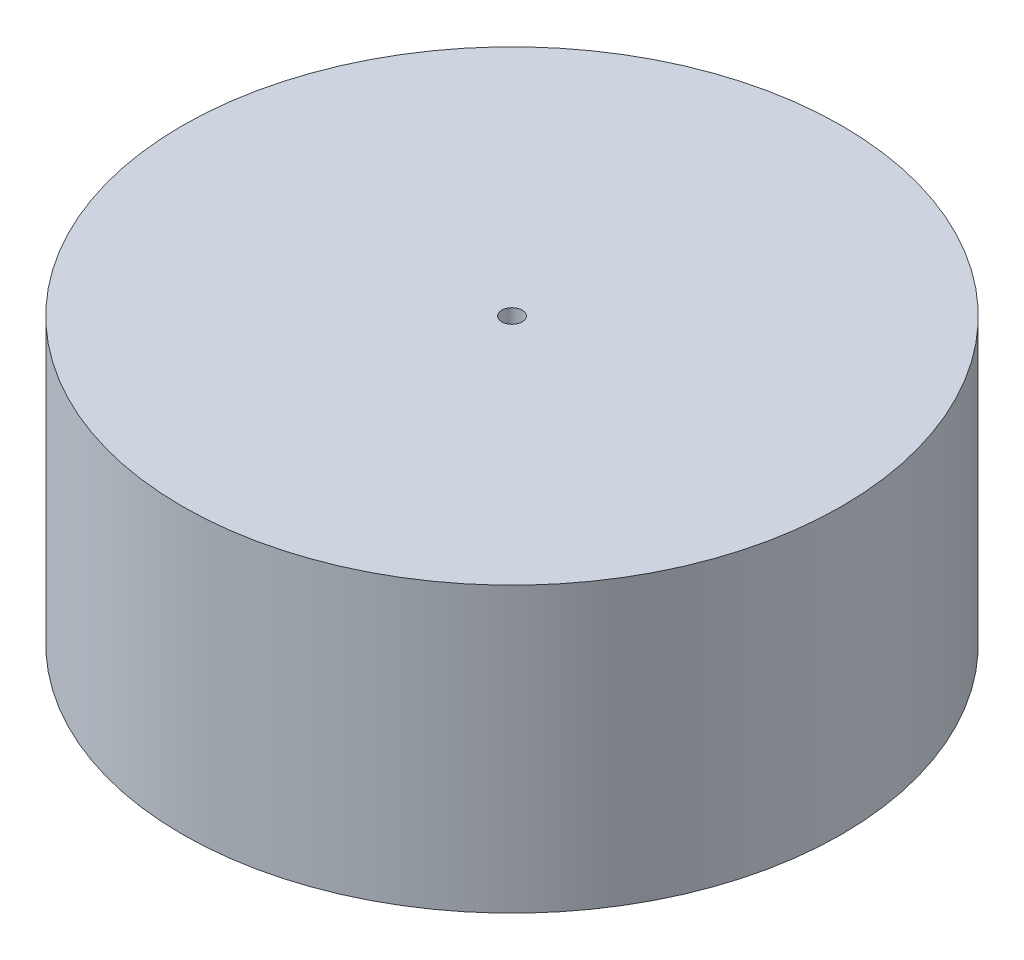
ISO-10303-21;
HEADER;
FILE_DESCRIPTION(('STEP AP214'),'2;1');
FILE_NAME('part.step','',(''),(''),'','','');
FILE_SCHEMA(('AUTOMOTIVE_DESIGN { 1 0 10303 214 1 1 1 1 }'));
ENDSEC;
DATA;
#1=APPLICATION_CONTEXT('core data for automotive mechanical design processes');
#2=APPLICATION_PROTOCOL_DEFINITION('international standard','automotive_design',2000,#1);
#3=PRODUCT_CONTEXT('',#1,'mechanical');
#4=PRODUCT('Part','Part','',(#3));
#5=PRODUCT_RELATED_PRODUCT_CATEGORY('part','',(#4));
#6=PRODUCT_DEFINITION_FORMATION('','',#4);
#7=PRODUCT_DEFINITION_CONTEXT('part definition',#1,'design');
#8=PRODUCT_DEFINITION('design','',#6,#7);
#9=PRODUCT_DEFINITION_SHAPE('','',#8);
#10=(LENGTH_UNIT() NAMED_UNIT(*) SI_UNIT(.MILLI.,.METRE.));
#11=(NAMED_UNIT(*) PLANE_ANGLE_UNIT() SI_UNIT($,.RADIAN.));
#12=(NAMED_UNIT(*) SI_UNIT($,.STERADIAN.) SOLID_ANGLE_UNIT());
#13=UNCERTAINTY_MEASURE_WITH_UNIT(LENGTH_MEASURE(1.E-05),#10,'distance_accuracy_value','');
#14=(GEOMETRIC_REPRESENTATION_CONTEXT(3) GLOBAL_UNCERTAINTY_ASSIGNED_CONTEXT((#13)) GLOBAL_UNIT_ASSIGNED_CONTEXT((#10,
#11,#12)) REPRESENTATION_CONTEXT('',''));
#15=CARTESIAN_POINT('',(0.,0.,0.));
#16=DIRECTION('',(0.,0.,1.));
#17=DIRECTION('',(1.,0.,0.));
#18=AXIS2_PLACEMENT_3D('',#15,#16,#17);
#19=CARTESIAN_POINT('',(0.,-25.,0.));
#20=DIRECTION('',(0.,1.,0.));
#21=DIRECTION('',(0.,0.,1.));
#22=AXIS2_PLACEMENT_3D('',#19,#20,#21);
#23=CYLINDRICAL_SURFACE('',#22,30.5);
#24=CARTESIAN_POINT('',(0.,0.,0.));
#25=DIRECTION('',(0.,-1.,0.));
#26=DIRECTION('',(0.,0.,-1.));
#27=AXIS2_PLACEMENT_3D('',#24,#25,#26);
#28=CIRCLE('',#27,30.5);
#29=CARTESIAN_POINT('',(0.,0.,-30.5));
#30=VERTEX_POINT('',#29);
#31=EDGE_CURVE('E123',#30,#30,#28,.T.);
#32=ORIENTED_EDGE('',*,*,#31,.F.);
#33=EDGE_LOOP('',(#32));
#34=FACE_BOUND('',#33,.T.);
#35=CARTESIAN_POINT('',(0.,-23.,0.));
#36=DIRECTION('',(0.,-1.,0.));
#37=DIRECTION('',(0.,0.,-1.));
#38=AXIS2_PLACEMENT_3D('',#35,#36,#37);
#39=CIRCLE('',#38,30.5);
#40=CARTESIAN_POINT('',(5.29626941884138,-23.,30.0366364668723));
#41=VERTEX_POINT('',#40);
#42=CARTESIAN_POINT('',(-5.29626941884138,-23.,30.0366364668723));
#43=VERTEX_POINT('',#42);
#44=EDGE_CURVE('E57',#41,#43,#39,.F.);
#45=ORIENTED_EDGE('',*,*,#44,.F.);
#46=DIRECTION('',(0.,-1.,0.));
#47=VECTOR('',#46,1.);
#48=CARTESIAN_POINT('',(5.29626941884138,-23.,30.0366364668723));
#49=LINE('',#48,#47);
#50=CARTESIAN_POINT('',(5.29626941884138,-25.,30.0366364668723));
#51=VERTEX_POINT('',#50);
#52=EDGE_CURVE('E124',#41,#51,#49,.T.);
#53=ORIENTED_EDGE('',*,*,#52,.T.);
#54=CARTESIAN_POINT('',(0.,-25.,0.));
#55=DIRECTION('',(0.,-1.,0.));
#56=DIRECTION('',(0.,0.,-1.));
#57=AXIS2_PLACEMENT_3D('',#54,#55,#56);
#58=CIRCLE('',#57,30.5);
#59=CARTESIAN_POINT('',(-5.29626941884138,-25.,30.0366364668723));
#60=VERTEX_POINT('',#59);
#61=EDGE_CURVE('E129',#51,#60,#58,.T.);
#62=ORIENTED_EDGE('',*,*,#61,.T.);
#63=DIRECTION('',(0.,-1.,0.));
#64=VECTOR('',#63,1.);
#65=CARTESIAN_POINT('',(-5.29626941884138,-23.,30.0366364668723));
#66=LINE('',#65,#64);
#67=EDGE_CURVE('E62',#43,#60,#66,.T.);
#68=ORIENTED_EDGE('',*,*,#67,.F.);
#69=EDGE_LOOP('',(#45,#53,#62,#68));
#70=FACE_BOUND('',#69,.T.);
#71=ADVANCED_FACE('F41',(#34,#70),#23,.F.);
#72=CARTESIAN_POINT('',(0.,0.,0.));
#73=DIRECTION('',(0.,1.,0.));
#74=DIRECTION('',(0.,0.,1.));
#75=AXIS2_PLACEMENT_3D('',#72,#73,#74);
#76=PLANE('',#75);
#77=CARTESIAN_POINT('',(0.,0.,0.));
#78=DIRECTION('',(0.,1.,0.));
#79=DIRECTION('',(0.,0.,1.));
#80=AXIS2_PLACEMENT_3D('',#77,#78,#79);
#81=CIRCLE('',#80,1.);
#82=CARTESIAN_POINT('',(0.,0.,1.));
#83=VERTEX_POINT('',#82);
#84=EDGE_CURVE('E139',#83,#83,#81,.T.);
#85=ORIENTED_EDGE('',*,*,#84,.T.);
#86=EDGE_LOOP('',(#85));
#87=FACE_BOUND('',#86,.T.);
#88=ORIENTED_EDGE('',*,*,#31,.T.);
#89=EDGE_LOOP('',(#88));
#90=FACE_BOUND('',#89,.T.);
#91=ADVANCED_FACE('F146',(#87,#90),#76,.F.);
#92=CARTESIAN_POINT('',(0.,3.,0.));
#93=DIRECTION('',(0.,1.,0.));
#94=DIRECTION('',(0.,0.,1.));
#95=AXIS2_PLACEMENT_3D('',#92,#93,#94);
#96=PLANE('',#95);
#97=CARTESIAN_POINT('',(0.,3.,0.));
#98=DIRECTION('',(0.,1.,0.));
#99=DIRECTION('',(0.,0.,1.));
#100=AXIS2_PLACEMENT_3D('',#97,#98,#99);
#101=CIRCLE('',#100,32.5);
#102=CARTESIAN_POINT('',(0.,3.,32.5));
#103=VERTEX_POINT('',#102);
#104=EDGE_CURVE('E11',#103,#103,#101,.T.);
#105=ORIENTED_EDGE('',*,*,#104,.T.);
#106=EDGE_LOOP('',(#105));
#107=FACE_BOUND('',#106,.T.);
#108=CARTESIAN_POINT('',(0.,3.,0.));
#109=DIRECTION('',(0.,1.,0.));
#110=DIRECTION('',(0.,0.,1.));
#111=AXIS2_PLACEMENT_3D('',#108,#109,#110);
#112=CIRCLE('',#111,1.);
#113=CARTESIAN_POINT('',(0.,3.,1.));
#114=VERTEX_POINT('',#113);
#115=EDGE_CURVE('E50',#114,#114,#112,.T.);
#116=ORIENTED_EDGE('',*,*,#115,.F.);
#117=EDGE_LOOP('',(#116));
#118=FACE_BOUND('',#117,.T.);
#119=ADVANCED_FACE('F160',(#107,#118),#96,.T.);
#120=CARTESIAN_POINT('',(0.,3.,0.));
#121=DIRECTION('',(0.,-1.,0.));
#122=DIRECTION('',(0.,0.,-1.));
#123=AXIS2_PLACEMENT_3D('',#120,#121,#122);
#124=CYLINDRICAL_SURFACE('',#123,32.5);
#125=ORIENTED_EDGE('',*,*,#104,.F.);
#126=EDGE_LOOP('',(#125));
#127=FACE_BOUND('',#126,.T.);
#128=CARTESIAN_POINT('',(0.,-25.,0.));
#129=DIRECTION('',(0.,-1.,0.));
#130=DIRECTION('',(0.,0.,-1.));
#131=AXIS2_PLACEMENT_3D('',#128,#129,#130);
#132=CIRCLE('',#131,32.5);
#133=CARTESIAN_POINT('',(0.,-25.,-32.5));
#134=VERTEX_POINT('',#133);
#135=EDGE_CURVE('E132',#134,#134,#132,.T.);
#136=ORIENTED_EDGE('',*,*,#135,.F.);
#137=EDGE_LOOP('',(#136));
#138=FACE_BOUND('',#137,.T.);
#139=ADVANCED_FACE('F43',(#127,#138),#124,.T.);
#140=CARTESIAN_POINT('',(0.,3.,0.));
#141=DIRECTION('',(0.,-1.,0.));
#142=DIRECTION('',(0.,0.,-1.));
#143=AXIS2_PLACEMENT_3D('',#140,#141,#142);
#144=CYLINDRICAL_SURFACE('',#143,1.);
#145=ORIENTED_EDGE('',*,*,#115,.T.);
#146=EDGE_LOOP('',(#145));
#147=FACE_BOUND('',#146,.T.);
#148=ORIENTED_EDGE('',*,*,#84,.F.);
#149=EDGE_LOOP('',(#148));
#150=FACE_BOUND('',#149,.T.);
#151=ADVANCED_FACE('F149',(#147,#150),#144,.F.);
#152=CARTESIAN_POINT('',(0.,-25.,0.));
#153=DIRECTION('',(0.,-1.,0.));
#154=DIRECTION('',(0.,0.,-1.));
#155=AXIS2_PLACEMENT_3D('',#152,#153,#154);
#156=PLANE('',#155);
#157=ORIENTED_EDGE('',*,*,#135,.T.);
#158=EDGE_LOOP('',(#157));
#159=FACE_BOUND('',#158,.T.);
#160=ORIENTED_EDGE('',*,*,#61,.F.);
#161=DIRECTION('',(0.173648177666931,0.,0.984807753012208));
#162=VECTOR('',#161,1.);
#163=CARTESIAN_POINT('',(0.,-25.,0.));
#164=LINE('',#163,#162);
#165=CARTESIAN_POINT('',(4.77532488584059,-25.,27.0822132078357));
#166=VERTEX_POINT('',#165);
#167=EDGE_CURVE('E103',#166,#51,#164,.T.);
#168=ORIENTED_EDGE('',*,*,#167,.F.);
#169=CARTESIAN_POINT('',(0.,-25.,0.));
#170=DIRECTION('',(0.,-1.,0.));
#171=DIRECTION('',(0.,0.,-1.));
#172=AXIS2_PLACEMENT_3D('',#169,#170,#171);
#173=CIRCLE('',#172,27.5);
#174=CARTESIAN_POINT('',(-4.77532488584059,-25.,27.0822132078357));
#175=VERTEX_POINT('',#174);
#176=EDGE_CURVE('E113',#175,#166,#173,.T.);
#177=ORIENTED_EDGE('',*,*,#176,.F.);
#178=DIRECTION('',(-0.173648177666931,0.,0.984807753012208));
#179=VECTOR('',#178,1.);
#180=CARTESIAN_POINT('',(0.,-25.,0.));
#181=LINE('',#180,#179);
#182=EDGE_CURVE('E88',#175,#60,#181,.T.);
#183=ORIENTED_EDGE('',*,*,#182,.T.);
#184=EDGE_LOOP('',(#160,#168,#177,#183));
#185=FACE_BOUND('',#184,.T.);
#186=ADVANCED_FACE('F151',(#159,#185),#156,.T.);
#187=CARTESIAN_POINT('',(0.,-23.,0.));
#188=DIRECTION('',(0.,-1.,0.));
#189=DIRECTION('',(0.,0.,-1.));
#190=AXIS2_PLACEMENT_3D('',#187,#188,#189);
#191=CYLINDRICAL_SURFACE('',#190,27.5);
#192=ORIENTED_EDGE('',*,*,#176,.T.);
#193=DIRECTION('',(0.,-1.,0.));
#194=VECTOR('',#193,1.);
#195=CARTESIAN_POINT('',(4.77532488584059,-23.,27.0822132078357));
#196=LINE('',#195,#194);
#197=CARTESIAN_POINT('',(4.77532488584059,-23.,27.0822132078357));
#198=VERTEX_POINT('',#197);
#199=EDGE_CURVE('E100',#198,#166,#196,.T.);
#200=ORIENTED_EDGE('',*,*,#199,.F.);
#201=CARTESIAN_POINT('',(0.,-23.,0.));
#202=DIRECTION('',(0.,-1.,0.));
#203=DIRECTION('',(0.,0.,-1.));
#204=AXIS2_PLACEMENT_3D('',#201,#202,#203);
#205=CIRCLE('',#204,27.5);
#206=CARTESIAN_POINT('',(-4.77532488584059,-23.,27.0822132078357));
#207=VERTEX_POINT('',#206);
#208=EDGE_CURVE('E97',#207,#198,#205,.T.);
#209=ORIENTED_EDGE('',*,*,#208,.F.);
#210=DIRECTION('',(0.,-1.,0.));
#211=VECTOR('',#210,1.);
#212=CARTESIAN_POINT('',(-4.77532488584059,-23.,27.0822132078357));
#213=LINE('',#212,#211);
#214=EDGE_CURVE('E82',#207,#175,#213,.T.);
#215=ORIENTED_EDGE('',*,*,#214,.T.);
#216=EDGE_LOOP('',(#192,#200,#209,#215));
#217=FACE_BOUND('',#216,.T.);
#218=ADVANCED_FACE('F98',(#217),#191,.F.);
#219=CARTESIAN_POINT('',(0.,-23.,0.));
#220=DIRECTION('',(0.984807753012208,0.,-0.173648177666931));
#221=DIRECTION('',(-0.173648177666931,0.,-0.984807753012208));
#222=AXIS2_PLACEMENT_3D('',#219,#220,#221);
#223=PLANE('',#222);
#224=ORIENTED_EDGE('',*,*,#167,.T.);
#225=ORIENTED_EDGE('',*,*,#52,.F.);
#226=DIRECTION('',(0.173648177666931,0.,0.984807753012208));
#227=VECTOR('',#226,1.);
#228=CARTESIAN_POINT('',(0.,-23.,0.));
#229=LINE('',#228,#227);
#230=EDGE_CURVE('E93',#198,#41,#229,.T.);
#231=ORIENTED_EDGE('',*,*,#230,.F.);
#232=ORIENTED_EDGE('',*,*,#199,.T.);
#233=EDGE_LOOP('',(#224,#225,#231,#232));
#234=FACE_BOUND('',#233,.T.);
#235=ADVANCED_FACE('F173',(#234),#223,.F.);
#236=CARTESIAN_POINT('',(0.,-23.,0.));
#237=DIRECTION('',(0.984807753012208,0.,0.173648177666931));
#238=DIRECTION('',(0.173648177666931,0.,-0.984807753012208));
#239=AXIS2_PLACEMENT_3D('',#236,#237,#238);
#240=PLANE('',#239);
#241=ORIENTED_EDGE('',*,*,#182,.F.);
#242=ORIENTED_EDGE('',*,*,#214,.F.);
#243=DIRECTION('',(-0.173648177666931,0.,0.984807753012208));
#244=VECTOR('',#243,1.);
#245=CARTESIAN_POINT('',(0.,-23.,0.));
#246=LINE('',#245,#244);
#247=EDGE_CURVE('E86',#207,#43,#246,.T.);
#248=ORIENTED_EDGE('',*,*,#247,.T.);
#249=ORIENTED_EDGE('',*,*,#67,.T.);
#250=EDGE_LOOP('',(#241,#242,#248,#249));
#251=FACE_BOUND('',#250,.T.);
#252=ADVANCED_FACE('F84',(#251),#240,.T.);
#253=CARTESIAN_POINT('',(0.,-23.,0.));
#254=DIRECTION('',(0.,-1.,0.));
#255=DIRECTION('',(0.,0.,-1.));
#256=AXIS2_PLACEMENT_3D('',#253,#254,#255);
#257=PLANE('',#256);
#258=ORIENTED_EDGE('',*,*,#208,.T.);
#259=ORIENTED_EDGE('',*,*,#230,.T.);
#260=ORIENTED_EDGE('',*,*,#44,.T.);
#261=ORIENTED_EDGE('',*,*,#247,.F.);
#262=EDGE_LOOP('',(#258,#259,#260,#261));
#263=FACE_BOUND('',#262,.T.);
#264=ADVANCED_FACE('F105',(#263),#257,.F.);
#265=CLOSED_SHELL('',(#71,#91,#119,#139,#151,#186,#218,#235,#252,#264));
#266=MANIFOLD_SOLID_BREP('B2',#265);
#267=ADVANCED_BREP_SHAPE_REPRESENTATION('',(#18,#266),#14);
#268=SHAPE_DEFINITION_REPRESENTATION(#9,#267);
ENDSEC;
END-ISO-10303-21;
